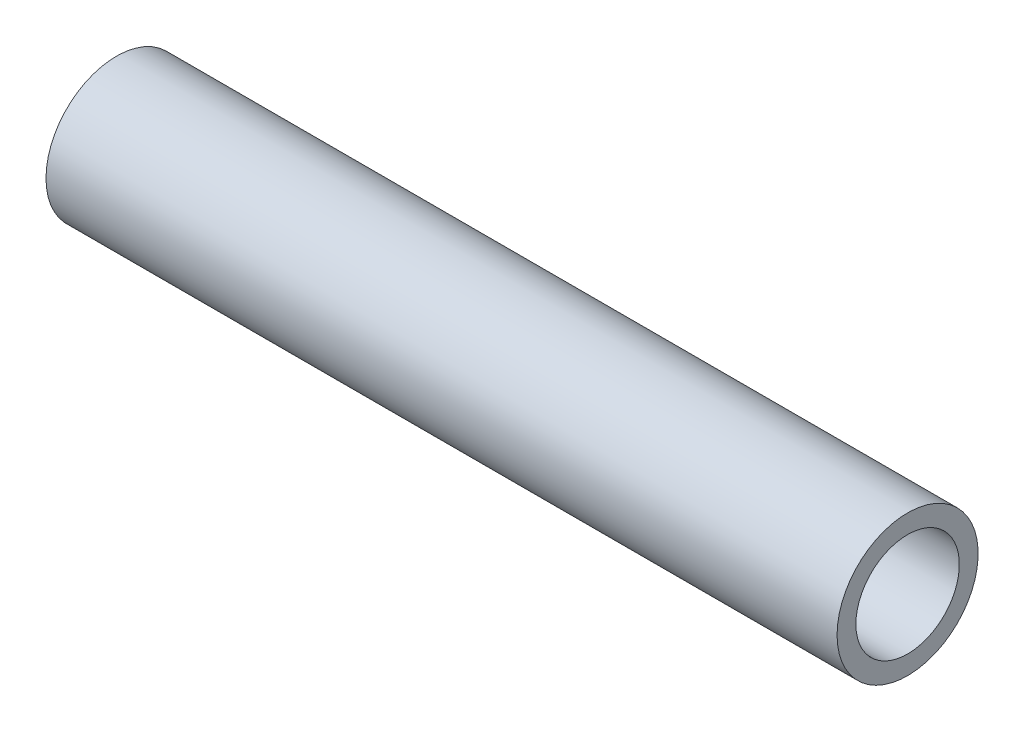
ISO-10303-21;
HEADER;
FILE_DESCRIPTION(('STEP AP214'),'2;1');
FILE_NAME('part.step','',(''),(''),'','','');
FILE_SCHEMA(('AUTOMOTIVE_DESIGN { 1 0 10303 214 1 1 1 1 }'));
ENDSEC;
DATA;
#1=APPLICATION_CONTEXT('core data for automotive mechanical design processes');
#2=APPLICATION_PROTOCOL_DEFINITION('international standard','automotive_design',2000,#1);
#3=PRODUCT_CONTEXT('',#1,'mechanical');
#4=PRODUCT('Part','Part','',(#3));
#5=PRODUCT_RELATED_PRODUCT_CATEGORY('part','',(#4));
#6=PRODUCT_DEFINITION_FORMATION('','',#4);
#7=PRODUCT_DEFINITION_CONTEXT('part definition',#1,'design');
#8=PRODUCT_DEFINITION('design','',#6,#7);
#9=PRODUCT_DEFINITION_SHAPE('','',#8);
#10=(LENGTH_UNIT() NAMED_UNIT(*) SI_UNIT(.MILLI.,.METRE.));
#11=(NAMED_UNIT(*) PLANE_ANGLE_UNIT() SI_UNIT($,.RADIAN.));
#12=(NAMED_UNIT(*) SI_UNIT($,.STERADIAN.) SOLID_ANGLE_UNIT());
#13=UNCERTAINTY_MEASURE_WITH_UNIT(LENGTH_MEASURE(1.E-05),#10,'distance_accuracy_value','');
#14=(GEOMETRIC_REPRESENTATION_CONTEXT(3) GLOBAL_UNCERTAINTY_ASSIGNED_CONTEXT((#13)) GLOBAL_UNIT_ASSIGNED_CONTEXT((#10,
#11,#12)) REPRESENTATION_CONTEXT('',''));
#15=CARTESIAN_POINT('',(0.,0.,0.));
#16=DIRECTION('',(0.,0.,1.));
#17=DIRECTION('',(1.,0.,0.));
#18=AXIS2_PLACEMENT_3D('',#15,#16,#17);
#19=CARTESIAN_POINT('',(0.,2.25,0.));
#20=DIRECTION('',(1.,0.,0.));
#21=DIRECTION('',(0.,0.,-1.));
#22=AXIS2_PLACEMENT_3D('',#19,#20,#21);
#23=PLANE('',#22);
#24=CARTESIAN_POINT('',(0.,0.,0.));
#25=DIRECTION('',(-1.,0.,0.));
#26=DIRECTION('',(0.,0.,1.));
#27=AXIS2_PLACEMENT_3D('',#24,#25,#26);
#28=CIRCLE('',#27,1.65);
#29=CARTESIAN_POINT('',(0.,0.,1.65));
#30=VERTEX_POINT('',#29);
#31=EDGE_CURVE('E10',#30,#30,#28,.T.);
#32=ORIENTED_EDGE('',*,*,#31,.F.);
#33=EDGE_LOOP('',(#32));
#34=FACE_BOUND('',#33,.T.);
#35=CARTESIAN_POINT('',(0.,0.,0.));
#36=DIRECTION('',(-1.,0.,0.));
#37=DIRECTION('',(0.,0.,1.));
#38=AXIS2_PLACEMENT_3D('',#35,#36,#37);
#39=CIRCLE('',#38,2.25);
#40=CARTESIAN_POINT('',(0.,0.,2.25));
#41=VERTEX_POINT('',#40);
#42=EDGE_CURVE('E45',#41,#41,#39,.T.);
#43=ORIENTED_EDGE('',*,*,#42,.T.);
#44=EDGE_LOOP('',(#43));
#45=FACE_BOUND('',#44,.T.);
#46=ADVANCED_FACE('F31',(#34,#45),#23,.F.);
#47=CARTESIAN_POINT('',(-110.,0.,0.));
#48=DIRECTION('',(-1.,0.,0.));
#49=DIRECTION('',(0.,0.,1.));
#50=AXIS2_PLACEMENT_3D('',#47,#48,#49);
#51=CYLINDRICAL_SURFACE('',#50,1.65);
#52=CARTESIAN_POINT('',(25.2356890137757,0.,0.));
#53=DIRECTION('',(-1.,0.,0.));
#54=DIRECTION('',(0.,0.,1.));
#55=AXIS2_PLACEMENT_3D('',#52,#53,#54);
#56=CIRCLE('',#55,1.65);
#57=CARTESIAN_POINT('',(25.2356890137757,0.,1.65));
#58=VERTEX_POINT('',#57);
#59=EDGE_CURVE('E37',#58,#58,#56,.T.);
#60=ORIENTED_EDGE('',*,*,#59,.F.);
#61=EDGE_LOOP('',(#60));
#62=FACE_BOUND('',#61,.T.);
#63=ORIENTED_EDGE('',*,*,#31,.T.);
#64=EDGE_LOOP('',(#63));
#65=FACE_BOUND('',#64,.T.);
#66=ADVANCED_FACE('F60',(#62,#65),#51,.F.);
#67=CARTESIAN_POINT('',(25.2356890137757,1.65,0.));
#68=DIRECTION('',(-1.,0.,0.));
#69=DIRECTION('',(0.,0.,1.));
#70=AXIS2_PLACEMENT_3D('',#67,#68,#69);
#71=PLANE('',#70);
#72=CARTESIAN_POINT('',(25.2356890137757,0.,0.));
#73=DIRECTION('',(-1.,0.,0.));
#74=DIRECTION('',(0.,0.,1.));
#75=AXIS2_PLACEMENT_3D('',#72,#73,#74);
#76=CIRCLE('',#75,2.25);
#77=CARTESIAN_POINT('',(25.2356890137757,0.,2.25));
#78=VERTEX_POINT('',#77);
#79=EDGE_CURVE('E41',#78,#78,#76,.T.);
#80=ORIENTED_EDGE('',*,*,#79,.F.);
#81=EDGE_LOOP('',(#80));
#82=FACE_BOUND('',#81,.T.);
#83=ORIENTED_EDGE('',*,*,#59,.T.);
#84=EDGE_LOOP('',(#83));
#85=FACE_BOUND('',#84,.T.);
#86=ADVANCED_FACE('F55',(#82,#85),#71,.F.);
#87=CARTESIAN_POINT('',(-110.,0.,0.));
#88=DIRECTION('',(-1.,0.,0.));
#89=DIRECTION('',(0.,0.,1.));
#90=AXIS2_PLACEMENT_3D('',#87,#88,#89);
#91=CYLINDRICAL_SURFACE('',#90,2.25);
#92=ORIENTED_EDGE('',*,*,#42,.F.);
#93=EDGE_LOOP('',(#92));
#94=FACE_BOUND('',#93,.T.);
#95=ORIENTED_EDGE('',*,*,#79,.T.);
#96=EDGE_LOOP('',(#95));
#97=FACE_BOUND('',#96,.T.);
#98=ADVANCED_FACE('F52',(#94,#97),#91,.T.);
#99=CLOSED_SHELL('',(#46,#66,#86,#98));
#100=MANIFOLD_SOLID_BREP('B2',#99);
#101=ADVANCED_BREP_SHAPE_REPRESENTATION('',(#18,#100),#14);
#102=SHAPE_DEFINITION_REPRESENTATION(#9,#101);
ENDSEC;
END-ISO-10303-21;
